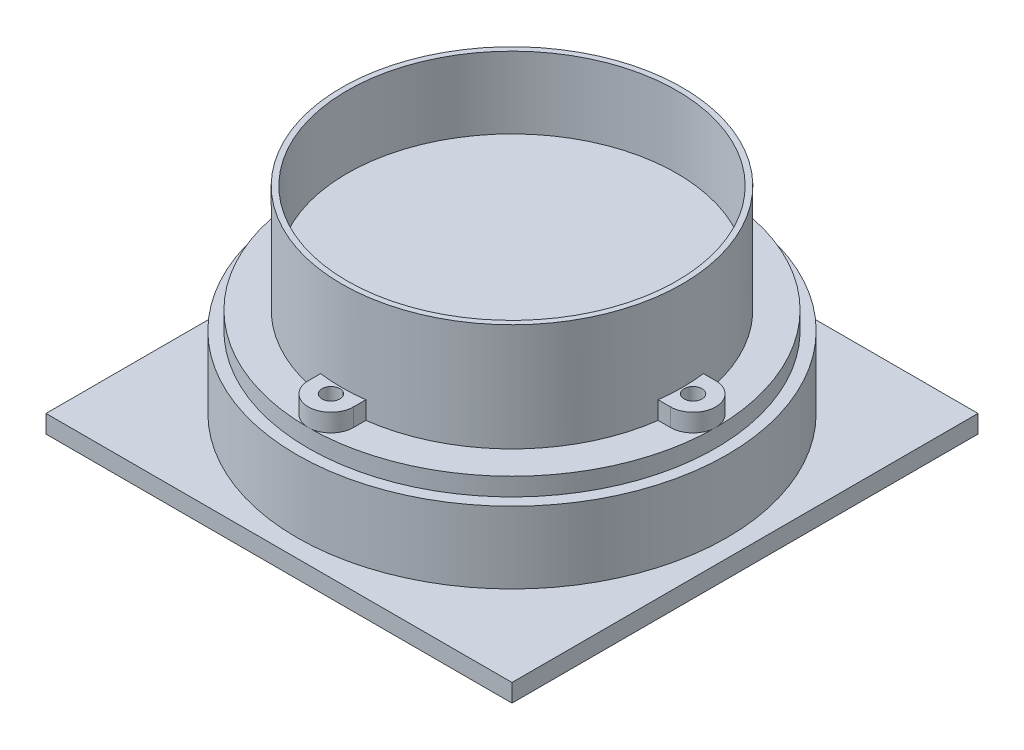
ISO-10303-21;
HEADER;
FILE_DESCRIPTION(('STEP AP214'),'2;1');
FILE_NAME('part.step','',(''),(''),'','','');
FILE_SCHEMA(('AUTOMOTIVE_DESIGN { 1 0 10303 214 1 1 1 1 }'));
ENDSEC;
DATA;
#1=APPLICATION_CONTEXT('core data for automotive mechanical design processes');
#2=APPLICATION_PROTOCOL_DEFINITION('international standard','automotive_design',2000,#1);
#3=PRODUCT_CONTEXT('',#1,'mechanical');
#4=PRODUCT('Part','Part','',(#3));
#5=PRODUCT_RELATED_PRODUCT_CATEGORY('part','',(#4));
#6=PRODUCT_DEFINITION_FORMATION('','',#4);
#7=PRODUCT_DEFINITION_CONTEXT('part definition',#1,'design');
#8=PRODUCT_DEFINITION('design','',#6,#7);
#9=PRODUCT_DEFINITION_SHAPE('','',#8);
#10=(LENGTH_UNIT() NAMED_UNIT(*) SI_UNIT(.MILLI.,.METRE.));
#11=(NAMED_UNIT(*) PLANE_ANGLE_UNIT() SI_UNIT($,.RADIAN.));
#12=(NAMED_UNIT(*) SI_UNIT($,.STERADIAN.) SOLID_ANGLE_UNIT());
#13=UNCERTAINTY_MEASURE_WITH_UNIT(LENGTH_MEASURE(1.E-05),#10,'distance_accuracy_value','');
#14=(GEOMETRIC_REPRESENTATION_CONTEXT(3) GLOBAL_UNCERTAINTY_ASSIGNED_CONTEXT((#13)) GLOBAL_UNIT_ASSIGNED_CONTEXT((#10,
#11,#12)) REPRESENTATION_CONTEXT('',''));
#15=CARTESIAN_POINT('',(0.,0.,0.));
#16=DIRECTION('',(0.,0.,1.));
#17=DIRECTION('',(1.,0.,0.));
#18=AXIS2_PLACEMENT_3D('',#15,#16,#17);
#19=CARTESIAN_POINT('',(0.,63.5,0.));
#20=DIRECTION('',(0.,-1.,0.));
#21=DIRECTION('',(0.,0.,-1.));
#22=AXIS2_PLACEMENT_3D('',#19,#20,#21);
#23=CYLINDRICAL_SURFACE('',#22,120.65);
#24=CARTESIAN_POINT('',(0.,63.5,0.));
#25=DIRECTION('',(0.,1.,0.));
#26=DIRECTION('',(0.,0.,1.));
#27=AXIS2_PLACEMENT_3D('',#24,#25,#26);
#28=CIRCLE('',#27,120.65);
#29=CARTESIAN_POINT('',(0.,63.5,120.65));
#30=VERTEX_POINT('',#29);
#31=EDGE_CURVE('E11',#30,#30,#28,.T.);
#32=ORIENTED_EDGE('',*,*,#31,.F.);
#33=EDGE_LOOP('',(#32));
#34=FACE_BOUND('',#33,.T.);
#35=CARTESIAN_POINT('',(0.,0.,0.));
#36=DIRECTION('',(0.,1.,0.));
#37=DIRECTION('',(0.,0.,1.));
#38=AXIS2_PLACEMENT_3D('',#35,#36,#37);
#39=CIRCLE('',#38,120.65);
#40=CARTESIAN_POINT('',(-16.0262997807594,0.,119.580852210282));
#41=VERTEX_POINT('',#40);
#42=CARTESIAN_POINT('',(16.0262997807595,0.,119.580852210282));
#43=VERTEX_POINT('',#42);
#44=EDGE_CURVE('E315',#41,#43,#39,.T.);
#45=ORIENTED_EDGE('',*,*,#44,.T.);
#46=DIRECTION('',(0.,1.,0.));
#47=VECTOR('',#46,1.);
#48=CARTESIAN_POINT('',(16.0262997807595,-12.7,119.580852210282));
#49=LINE('',#48,#47);
#50=CARTESIAN_POINT('',(16.0262997807595,-12.7,119.580852210282));
#51=VERTEX_POINT('',#50);
#52=EDGE_CURVE('E295',#51,#43,#49,.T.);
#53=ORIENTED_EDGE('',*,*,#52,.F.);
#54=CARTESIAN_POINT('',(0.,-12.7,0.));
#55=DIRECTION('',(0.,-1.,0.));
#56=DIRECTION('',(0.,0.,-1.));
#57=AXIS2_PLACEMENT_3D('',#54,#55,#56);
#58=CIRCLE('',#57,120.65);
#59=CARTESIAN_POINT('',(119.580852210282,-12.7,16.026299780759));
#60=VERTEX_POINT('',#59);
#61=EDGE_CURVE('E257',#60,#51,#58,.T.);
#62=ORIENTED_EDGE('',*,*,#61,.F.);
#63=DIRECTION('',(0.,1.,0.));
#64=VECTOR('',#63,1.);
#65=CARTESIAN_POINT('',(119.580852210282,-12.7,16.026299780759));
#66=LINE('',#65,#64);
#67=CARTESIAN_POINT('',(119.580852210282,0.,16.026299780759));
#68=VERTEX_POINT('',#67);
#69=EDGE_CURVE('E299',#60,#68,#66,.T.);
#70=ORIENTED_EDGE('',*,*,#69,.T.);
#71=CARTESIAN_POINT('',(119.580852210282,0.,-16.0262997807599));
#72=VERTEX_POINT('',#71);
#73=EDGE_CURVE('E42',#68,#72,#39,.T.);
#74=ORIENTED_EDGE('',*,*,#73,.T.);
#75=DIRECTION('',(0.,1.,0.));
#76=VECTOR('',#75,1.);
#77=CARTESIAN_POINT('',(119.580852210282,-12.7,-16.0262997807599));
#78=LINE('',#77,#76);
#79=CARTESIAN_POINT('',(119.580852210282,-12.7,-16.0262997807599));
#80=VERTEX_POINT('',#79);
#81=EDGE_CURVE('E301',#80,#72,#78,.T.);
#82=ORIENTED_EDGE('',*,*,#81,.F.);
#83=CARTESIAN_POINT('',(16.0262997807585,-12.7,-119.580852210282));
#84=VERTEX_POINT('',#83);
#85=EDGE_CURVE('E240',#84,#80,#58,.T.);
#86=ORIENTED_EDGE('',*,*,#85,.F.);
#87=DIRECTION('',(0.,1.,0.));
#88=VECTOR('',#87,1.);
#89=CARTESIAN_POINT('',(16.0262997807585,-12.7,-119.580852210282));
#90=LINE('',#89,#88);
#91=CARTESIAN_POINT('',(16.0262997807585,0.,-119.580852210282));
#92=VERTEX_POINT('',#91);
#93=EDGE_CURVE('E305',#84,#92,#90,.T.);
#94=ORIENTED_EDGE('',*,*,#93,.T.);
#95=CARTESIAN_POINT('',(-16.0262997807603,0.,-119.580852210282));
#96=VERTEX_POINT('',#95);
#97=EDGE_CURVE('E327',#92,#96,#39,.T.);
#98=ORIENTED_EDGE('',*,*,#97,.T.);
#99=DIRECTION('',(0.,1.,0.));
#100=VECTOR('',#99,1.);
#101=CARTESIAN_POINT('',(-16.0262997807603,-12.7,-119.580852210282));
#102=LINE('',#101,#100);
#103=CARTESIAN_POINT('',(-16.0262997807603,-12.7,-119.580852210282));
#104=VERTEX_POINT('',#103);
#105=EDGE_CURVE('E307',#104,#96,#102,.T.);
#106=ORIENTED_EDGE('',*,*,#105,.F.);
#107=CARTESIAN_POINT('',(-119.580852210282,-12.7,-16.0262997807581));
#108=VERTEX_POINT('',#107);
#109=EDGE_CURVE('E235',#108,#104,#58,.T.);
#110=ORIENTED_EDGE('',*,*,#109,.F.);
#111=DIRECTION('',(0.,1.,0.));
#112=VECTOR('',#111,1.);
#113=CARTESIAN_POINT('',(-119.580852210282,-12.7,-16.0262997807581));
#114=LINE('',#113,#112);
#115=CARTESIAN_POINT('',(-119.580852210282,0.,-16.0262997807581));
#116=VERTEX_POINT('',#115);
#117=EDGE_CURVE('E311',#108,#116,#114,.T.);
#118=ORIENTED_EDGE('',*,*,#117,.T.);
#119=CARTESIAN_POINT('',(-119.580852210282,0.,16.0262997807607));
#120=VERTEX_POINT('',#119);
#121=EDGE_CURVE('E329',#116,#120,#39,.T.);
#122=ORIENTED_EDGE('',*,*,#121,.T.);
#123=DIRECTION('',(0.,1.,0.));
#124=VECTOR('',#123,1.);
#125=CARTESIAN_POINT('',(-119.580852210282,-12.7,16.0262997807607));
#126=LINE('',#125,#124);
#127=CARTESIAN_POINT('',(-119.580852210282,-12.7,16.0262997807607));
#128=VERTEX_POINT('',#127);
#129=EDGE_CURVE('E289',#128,#120,#126,.T.);
#130=ORIENTED_EDGE('',*,*,#129,.F.);
#131=CARTESIAN_POINT('',(-16.0262997807594,-12.7,119.580852210282));
#132=VERTEX_POINT('',#131);
#133=EDGE_CURVE('E239',#132,#128,#58,.T.);
#134=ORIENTED_EDGE('',*,*,#133,.F.);
#135=DIRECTION('',(0.,1.,0.));
#136=VECTOR('',#135,1.);
#137=CARTESIAN_POINT('',(-16.0262997807594,-12.7,119.580852210282));
#138=LINE('',#137,#136);
#139=EDGE_CURVE('E293',#132,#41,#138,.T.);
#140=ORIENTED_EDGE('',*,*,#139,.T.);
#141=EDGE_LOOP('',(#45,#53,#62,#70,#74,#82,#86,#94,#98,#106,#110,#118,#122,#130,#134,#140));
#142=FACE_BOUND('',#141,.T.);
#143=ADVANCED_FACE('F34',(#34,#142),#23,.T.);
#144=CARTESIAN_POINT('',(0.,63.5,0.));
#145=DIRECTION('',(0.,1.,0.));
#146=DIRECTION('',(0.,0.,1.));
#147=AXIS2_PLACEMENT_3D('',#144,#145,#146);
#148=PLANE('',#147);
#149=CARTESIAN_POINT('',(0.,63.5,0.));
#150=DIRECTION('',(0.,1.,0.));
#151=DIRECTION('',(0.,0.,1.));
#152=AXIS2_PLACEMENT_3D('',#149,#150,#151);
#153=CIRCLE('',#152,116.84);
#154=CARTESIAN_POINT('',(0.,63.5,116.84));
#155=VERTEX_POINT('',#154);
#156=EDGE_CURVE('E310',#155,#155,#153,.T.);
#157=ORIENTED_EDGE('',*,*,#156,.F.);
#158=EDGE_LOOP('',(#157));
#159=FACE_BOUND('',#158,.T.);
#160=ORIENTED_EDGE('',*,*,#31,.T.);
#161=EDGE_LOOP('',(#160));
#162=FACE_BOUND('',#161,.T.);
#163=ADVANCED_FACE('F478',(#159,#162),#148,.T.);
#164=CARTESIAN_POINT('',(0.,12.7,0.));
#165=DIRECTION('',(0.,1.,0.));
#166=DIRECTION('',(0.,0.,1.));
#167=AXIS2_PLACEMENT_3D('',#164,#165,#166);
#168=CYLINDRICAL_SURFACE('',#167,116.84);
#169=CARTESIAN_POINT('',(0.,12.7,0.));
#170=DIRECTION('',(0.,1.,0.));
#171=DIRECTION('',(0.,0.,1.));
#172=AXIS2_PLACEMENT_3D('',#169,#170,#171);
#173=CIRCLE('',#172,116.84);
#174=CARTESIAN_POINT('',(0.,12.7,116.84));
#175=VERTEX_POINT('',#174);
#176=EDGE_CURVE('E312',#175,#175,#173,.T.);
#177=ORIENTED_EDGE('',*,*,#176,.F.);
#178=EDGE_LOOP('',(#177));
#179=FACE_BOUND('',#178,.T.);
#180=ORIENTED_EDGE('',*,*,#156,.T.);
#181=EDGE_LOOP('',(#180));
#182=FACE_BOUND('',#181,.T.);
#183=ADVANCED_FACE('F483',(#179,#182),#168,.F.);
#184=CARTESIAN_POINT('',(0.,12.7,0.));
#185=DIRECTION('',(0.,1.,0.));
#186=DIRECTION('',(0.,0.,1.));
#187=AXIS2_PLACEMENT_3D('',#184,#185,#186);
#188=PLANE('',#187);
#189=ORIENTED_EDGE('',*,*,#176,.T.);
#190=EDGE_LOOP('',(#189));
#191=FACE_BOUND('',#190,.T.);
#192=ADVANCED_FACE('F490',(#191),#188,.T.);
#193=CARTESIAN_POINT('',(0.,0.,0.));
#194=DIRECTION('',(0.,-1.,0.));
#195=DIRECTION('',(0.,0.,-1.));
#196=AXIS2_PLACEMENT_3D('',#193,#194,#195);
#197=PLANE('',#196);
#198=CARTESIAN_POINT('',(128.324780402935,0.,-4.87942216035457E-13));
#199=DIRECTION('',(0.,1.,0.));
#200=DIRECTION('',(0.,0.,1.));
#201=AXIS2_PLACEMENT_3D('',#198,#199,#200);
#202=CIRCLE('',#201,6.35);
#203=CARTESIAN_POINT('',(128.324780402935,0.,6.34999999999951));
#204=VERTEX_POINT('',#203);
#205=EDGE_CURVE('E747',#204,#204,#202,.T.);
#206=ORIENTED_EDGE('',*,*,#205,.F.);
#207=EDGE_LOOP('',(#206));
#208=FACE_BOUND('',#207,.T.);
#209=ORIENTED_EDGE('',*,*,#73,.F.);
#210=DIRECTION('',(1.,0.,0.));
#211=VECTOR('',#210,1.);
#212=CARTESIAN_POINT('',(0.,0.,16.0262997807594));
#213=LINE('',#212,#211);
#214=CARTESIAN_POINT('',(128.324780402935,0.,16.0262997807589));
#215=VERTEX_POINT('',#214);
#216=EDGE_CURVE('E281',#68,#215,#213,.T.);
#217=ORIENTED_EDGE('',*,*,#216,.T.);
#218=CARTESIAN_POINT('',(128.324780402935,0.,-4.87942216035457E-13));
#219=DIRECTION('',(0.,-1.,0.));
#220=DIRECTION('',(0.,0.,-1.));
#221=AXIS2_PLACEMENT_3D('',#218,#219,#220);
#222=CIRCLE('',#221,16.0262997807594);
#223=CARTESIAN_POINT('',(128.324780402935,0.,-16.0262997807599));
#224=VERTEX_POINT('',#223);
#225=EDGE_CURVE('E278',#215,#224,#222,.F.);
#226=ORIENTED_EDGE('',*,*,#225,.T.);
#227=DIRECTION('',(1.,0.,0.));
#228=VECTOR('',#227,1.);
#229=CARTESIAN_POINT('',(0.,0.,-16.0262997807595));
#230=LINE('',#229,#228);
#231=EDGE_CURVE('E282',#72,#224,#230,.T.);
#232=ORIENTED_EDGE('',*,*,#231,.F.);
#233=EDGE_LOOP('',(#209,#217,#226,#232));
#234=FACE_BOUND('',#233,.T.);
#235=ADVANCED_FACE('F404',(#208,#234),#197,.F.);
#236=CARTESIAN_POINT('',(-9.42924686027354E-13,0.,-128.324780402935));
#237=DIRECTION('',(0.,1.,0.));
#238=DIRECTION('',(0.,0.,1.));
#239=AXIS2_PLACEMENT_3D('',#236,#237,#238);
#240=CIRCLE('',#239,6.35);
#241=CARTESIAN_POINT('',(-9.42924686027354E-13,0.,-121.974780402935));
#242=VERTEX_POINT('',#241);
#243=EDGE_CURVE('E761',#242,#242,#240,.T.);
#244=ORIENTED_EDGE('',*,*,#243,.F.);
#245=EDGE_LOOP('',(#244));
#246=FACE_BOUND('',#245,.T.);
#247=ORIENTED_EDGE('',*,*,#97,.F.);
#248=DIRECTION('',(0.,0.,-1.));
#249=VECTOR('',#248,1.);
#250=CARTESIAN_POINT('',(16.0262997807593,0.,-1.0810252862402E-13));
#251=LINE('',#250,#249);
#252=CARTESIAN_POINT('',(16.0262997807585,0.,-128.324780402935));
#253=VERTEX_POINT('',#252);
#254=EDGE_CURVE('E276',#92,#253,#251,.T.);
#255=ORIENTED_EDGE('',*,*,#254,.T.);
#256=CARTESIAN_POINT('',(-9.42924686027354E-13,0.,-128.324780402935));
#257=DIRECTION('',(0.,-1.,0.));
#258=DIRECTION('',(0.,0.,-1.));
#259=AXIS2_PLACEMENT_3D('',#256,#257,#258);
#260=CIRCLE('',#259,16.0262997807594);
#261=CARTESIAN_POINT('',(-16.0262997807604,0.,-128.324780402935));
#262=VERTEX_POINT('',#261);
#263=EDGE_CURVE('E273',#253,#262,#260,.F.);
#264=ORIENTED_EDGE('',*,*,#263,.T.);
#265=DIRECTION('',(0.,0.,-1.));
#266=VECTOR('',#265,1.);
#267=CARTESIAN_POINT('',(-16.0262997807595,0.,1.0810252862402E-13));
#268=LINE('',#267,#266);
#269=EDGE_CURVE('E277',#96,#262,#268,.T.);
#270=ORIENTED_EDGE('',*,*,#269,.F.);
#271=EDGE_LOOP('',(#247,#255,#264,#270));
#272=FACE_BOUND('',#271,.T.);
#273=ADVANCED_FACE('F439',(#246,#272),#197,.F.);
#274=CARTESIAN_POINT('',(-128.324780402935,0.,1.41178494382707E-12));
#275=DIRECTION('',(0.,1.,0.));
#276=DIRECTION('',(0.,0.,1.));
#277=AXIS2_PLACEMENT_3D('',#274,#275,#276);
#278=CIRCLE('',#277,6.35);
#279=CARTESIAN_POINT('',(-128.324780402935,0.,6.35000000000141));
#280=VERTEX_POINT('',#279);
#281=EDGE_CURVE('E755',#280,#280,#278,.T.);
#282=ORIENTED_EDGE('',*,*,#281,.F.);
#283=EDGE_LOOP('',(#282));
#284=FACE_BOUND('',#283,.T.);
#285=ORIENTED_EDGE('',*,*,#121,.F.);
#286=DIRECTION('',(-1.,0.,0.));
#287=VECTOR('',#286,1.);
#288=CARTESIAN_POINT('',(-1.6533327907203E-13,0.,-16.0262997807593));
#289=LINE('',#288,#287);
#290=CARTESIAN_POINT('',(-128.324780402935,0.,-16.026299780758));
#291=VERTEX_POINT('',#290);
#292=EDGE_CURVE('E272',#116,#291,#289,.T.);
#293=ORIENTED_EDGE('',*,*,#292,.T.);
#294=CARTESIAN_POINT('',(-128.324780402935,0.,1.41178494382707E-12));
#295=DIRECTION('',(0.,-1.,0.));
#296=DIRECTION('',(0.,0.,-1.));
#297=AXIS2_PLACEMENT_3D('',#294,#295,#296);
#298=CIRCLE('',#297,16.0262997807594);
#299=CARTESIAN_POINT('',(-128.324780402935,0.,16.0262997807608));
#300=VERTEX_POINT('',#299);
#301=EDGE_CURVE('E224',#291,#300,#298,.F.);
#302=ORIENTED_EDGE('',*,*,#301,.T.);
#303=DIRECTION('',(-1.,0.,0.));
#304=VECTOR('',#303,1.);
#305=CARTESIAN_POINT('',(1.65333279072031E-13,0.,16.0262997807595));
#306=LINE('',#305,#304);
#307=EDGE_CURVE('E361',#120,#300,#306,.T.);
#308=ORIENTED_EDGE('',*,*,#307,.F.);
#309=EDGE_LOOP('',(#285,#293,#302,#308));
#310=FACE_BOUND('',#309,.T.);
#311=ADVANCED_FACE('F455',(#284,#310),#197,.F.);
#312=CARTESIAN_POINT('',(-128.324780402935,-12.7,1.41178494382707E-12));
#313=DIRECTION('',(0.,1.,0.));
#314=DIRECTION('',(0.,0.,1.));
#315=AXIS2_PLACEMENT_3D('',#312,#313,#314);
#316=CYLINDRICAL_SURFACE('',#315,16.0262997807594);
#317=ORIENTED_EDGE('',*,*,#301,.F.);
#318=DIRECTION('',(0.,1.,0.));
#319=VECTOR('',#318,1.);
#320=CARTESIAN_POINT('',(-128.324780402935,-12.7,-16.026299780758));
#321=LINE('',#320,#319);
#322=CARTESIAN_POINT('',(-128.324780402935,-12.7,-16.026299780758));
#323=VERTEX_POINT('',#322);
#324=EDGE_CURVE('E308',#323,#291,#321,.T.);
#325=ORIENTED_EDGE('',*,*,#324,.F.);
#326=CARTESIAN_POINT('',(-128.324780402935,-12.7,1.41178494382707E-12));
#327=DIRECTION('',(0.,-1.,0.));
#328=DIRECTION('',(0.,0.,-1.));
#329=AXIS2_PLACEMENT_3D('',#326,#327,#328);
#330=CIRCLE('',#329,16.0262997807594);
#331=CARTESIAN_POINT('',(-144.351080183694,-12.7,1.58810076267898E-12));
#332=VERTEX_POINT('',#331);
#333=EDGE_CURVE('E229',#323,#332,#330,.F.);
#334=ORIENTED_EDGE('',*,*,#333,.T.);
#335=CARTESIAN_POINT('',(-128.324780402935,-12.7,16.0262997807608));
#336=VERTEX_POINT('',#335);
#337=EDGE_CURVE('E232',#332,#336,#330,.F.);
#338=ORIENTED_EDGE('',*,*,#337,.T.);
#339=DIRECTION('',(0.,1.,0.));
#340=VECTOR('',#339,1.);
#341=CARTESIAN_POINT('',(-128.324780402935,-12.7,16.0262997807608));
#342=LINE('',#341,#340);
#343=EDGE_CURVE('E269',#336,#300,#342,.T.);
#344=ORIENTED_EDGE('',*,*,#343,.T.);
#345=EDGE_LOOP('',(#317,#325,#334,#338,#344));
#346=FACE_BOUND('',#345,.T.);
#347=ADVANCED_FACE('F498',(#346),#316,.T.);
#348=CARTESIAN_POINT('',(-1.6533327907203E-13,-12.7,-16.0262997807593));
#349=DIRECTION('',(0.,0.,-1.));
#350=DIRECTION('',(-1.,0.,0.));
#351=AXIS2_PLACEMENT_3D('',#348,#349,#350);
#352=PLANE('',#351);
#353=ORIENTED_EDGE('',*,*,#292,.F.);
#354=ORIENTED_EDGE('',*,*,#117,.F.);
#355=DIRECTION('',(-1.,0.,0.));
#356=VECTOR('',#355,1.);
#357=CARTESIAN_POINT('',(-1.6533327907203E-13,-12.7,-16.0262997807593));
#358=LINE('',#357,#356);
#359=EDGE_CURVE('E231',#108,#323,#358,.T.);
#360=ORIENTED_EDGE('',*,*,#359,.T.);
#361=ORIENTED_EDGE('',*,*,#324,.T.);
#362=EDGE_LOOP('',(#353,#354,#360,#361));
#363=FACE_BOUND('',#362,.T.);
#364=ADVANCED_FACE('F452',(#363),#352,.T.);
#365=CARTESIAN_POINT('',(-16.0262997807595,-12.7,1.0810252862402E-13));
#366=DIRECTION('',(1.,0.,0.));
#367=DIRECTION('',(0.,0.,-1.));
#368=AXIS2_PLACEMENT_3D('',#365,#366,#367);
#369=PLANE('',#368);
#370=ORIENTED_EDGE('',*,*,#269,.T.);
#371=DIRECTION('',(0.,1.,0.));
#372=VECTOR('',#371,1.);
#373=CARTESIAN_POINT('',(-16.0262997807604,-12.7,-128.324780402935));
#374=LINE('',#373,#372);
#375=CARTESIAN_POINT('',(-16.0262997807604,-12.7,-128.324780402935));
#376=VERTEX_POINT('',#375);
#377=EDGE_CURVE('E304',#376,#262,#374,.T.);
#378=ORIENTED_EDGE('',*,*,#377,.F.);
#379=DIRECTION('',(0.,0.,-1.));
#380=VECTOR('',#379,1.);
#381=CARTESIAN_POINT('',(-16.0262997807595,-12.7,1.0810252862402E-13));
#382=LINE('',#381,#380);
#383=EDGE_CURVE('E238',#104,#376,#382,.T.);
#384=ORIENTED_EDGE('',*,*,#383,.F.);
#385=ORIENTED_EDGE('',*,*,#105,.T.);
#386=EDGE_LOOP('',(#370,#378,#384,#385));
#387=FACE_BOUND('',#386,.T.);
#388=ADVANCED_FACE('F443',(#387),#369,.F.);
#389=CARTESIAN_POINT('',(-9.42924686027354E-13,-12.7,-128.324780402935));
#390=DIRECTION('',(0.,1.,0.));
#391=DIRECTION('',(0.,0.,1.));
#392=AXIS2_PLACEMENT_3D('',#389,#390,#391);
#393=CYLINDRICAL_SURFACE('',#392,16.0262997807594);
#394=ORIENTED_EDGE('',*,*,#263,.F.);
#395=DIRECTION('',(0.,1.,0.));
#396=VECTOR('',#395,1.);
#397=CARTESIAN_POINT('',(16.0262997807585,-12.7,-128.324780402935));
#398=LINE('',#397,#396);
#399=CARTESIAN_POINT('',(16.0262997807585,-12.7,-128.324780402935));
#400=VERTEX_POINT('',#399);
#401=EDGE_CURVE('E302',#400,#253,#398,.T.);
#402=ORIENTED_EDGE('',*,*,#401,.F.);
#403=CARTESIAN_POINT('',(-9.42924686027354E-13,-12.7,-128.324780402935));
#404=DIRECTION('',(0.,-1.,0.));
#405=DIRECTION('',(0.,0.,-1.));
#406=AXIS2_PLACEMENT_3D('',#403,#404,#405);
#407=CIRCLE('',#406,16.0262997807594);
#408=CARTESIAN_POINT('',(-1.06068521241597E-12,-12.7,-144.351080183694));
#409=VERTEX_POINT('',#408);
#410=EDGE_CURVE('E244',#400,#409,#407,.F.);
#411=ORIENTED_EDGE('',*,*,#410,.T.);
#412=EDGE_CURVE('E243',#409,#376,#407,.F.);
#413=ORIENTED_EDGE('',*,*,#412,.T.);
#414=ORIENTED_EDGE('',*,*,#377,.T.);
#415=EDGE_LOOP('',(#394,#402,#411,#413,#414));
#416=FACE_BOUND('',#415,.T.);
#417=ADVANCED_FACE('F506',(#416),#393,.T.);
#418=CARTESIAN_POINT('',(16.0262997807593,-12.7,-1.0810252862402E-13));
#419=DIRECTION('',(1.,0.,0.));
#420=DIRECTION('',(0.,0.,-1.));
#421=AXIS2_PLACEMENT_3D('',#418,#419,#420);
#422=PLANE('',#421);
#423=ORIENTED_EDGE('',*,*,#254,.F.);
#424=ORIENTED_EDGE('',*,*,#93,.F.);
#425=DIRECTION('',(0.,0.,-1.));
#426=VECTOR('',#425,1.);
#427=CARTESIAN_POINT('',(16.0262997807593,-12.7,-1.0810252862402E-13));
#428=LINE('',#427,#426);
#429=EDGE_CURVE('E246',#84,#400,#428,.T.);
#430=ORIENTED_EDGE('',*,*,#429,.T.);
#431=ORIENTED_EDGE('',*,*,#401,.T.);
#432=EDGE_LOOP('',(#423,#424,#430,#431));
#433=FACE_BOUND('',#432,.T.);
#434=ADVANCED_FACE('F436',(#433),#422,.T.);
#435=CARTESIAN_POINT('',(0.,-12.7,-16.0262997807595));
#436=DIRECTION('',(0.,0.,1.));
#437=DIRECTION('',(1.,0.,0.));
#438=AXIS2_PLACEMENT_3D('',#435,#436,#437);
#439=PLANE('',#438);
#440=ORIENTED_EDGE('',*,*,#231,.T.);
#441=DIRECTION('',(0.,1.,0.));
#442=VECTOR('',#441,1.);
#443=CARTESIAN_POINT('',(128.324780402935,-12.7,-16.0262997807599));
#444=LINE('',#443,#442);
#445=CARTESIAN_POINT('',(128.324780402935,-12.7,-16.0262997807599));
#446=VERTEX_POINT('',#445);
#447=EDGE_CURVE('E298',#446,#224,#444,.T.);
#448=ORIENTED_EDGE('',*,*,#447,.F.);
#449=DIRECTION('',(1.,0.,0.));
#450=VECTOR('',#449,1.);
#451=CARTESIAN_POINT('',(0.,-12.7,-16.0262997807595));
#452=LINE('',#451,#450);
#453=EDGE_CURVE('E249',#80,#446,#452,.T.);
#454=ORIENTED_EDGE('',*,*,#453,.F.);
#455=ORIENTED_EDGE('',*,*,#81,.T.);
#456=EDGE_LOOP('',(#440,#448,#454,#455));
#457=FACE_BOUND('',#456,.T.);
#458=ADVANCED_FACE('F415',(#457),#439,.F.);
#459=CARTESIAN_POINT('',(128.324780402935,-12.7,-4.87942216035457E-13));
#460=DIRECTION('',(0.,1.,0.));
#461=DIRECTION('',(0.,0.,1.));
#462=AXIS2_PLACEMENT_3D('',#459,#460,#461);
#463=CYLINDRICAL_SURFACE('',#462,16.0262997807594);
#464=ORIENTED_EDGE('',*,*,#225,.F.);
#465=DIRECTION('',(0.,1.,0.));
#466=VECTOR('',#465,1.);
#467=CARTESIAN_POINT('',(128.324780402935,-12.7,16.0262997807589));
#468=LINE('',#467,#466);
#469=CARTESIAN_POINT('',(128.324780402935,-12.7,16.0262997807589));
#470=VERTEX_POINT('',#469);
#471=EDGE_CURVE('E296',#470,#215,#468,.T.);
#472=ORIENTED_EDGE('',*,*,#471,.F.);
#473=CARTESIAN_POINT('',(128.324780402935,-12.7,-4.87942216035457E-13));
#474=DIRECTION('',(0.,-1.,0.));
#475=DIRECTION('',(0.,0.,-1.));
#476=AXIS2_PLACEMENT_3D('',#473,#474,#475);
#477=CIRCLE('',#476,16.0262997807594);
#478=CARTESIAN_POINT('',(144.351080183694,-12.7,-5.48880627192819E-13));
#479=VERTEX_POINT('',#478);
#480=EDGE_CURVE('E58',#470,#479,#477,.F.);
#481=ORIENTED_EDGE('',*,*,#480,.T.);
#482=EDGE_CURVE('E252',#479,#446,#477,.F.);
#483=ORIENTED_EDGE('',*,*,#482,.T.);
#484=ORIENTED_EDGE('',*,*,#447,.T.);
#485=EDGE_LOOP('',(#464,#472,#481,#483,#484));
#486=FACE_BOUND('',#485,.T.);
#487=ADVANCED_FACE('F411',(#486),#463,.T.);
#488=CARTESIAN_POINT('',(0.,-12.7,16.0262997807594));
#489=DIRECTION('',(0.,0.,1.));
#490=DIRECTION('',(1.,0.,0.));
#491=AXIS2_PLACEMENT_3D('',#488,#489,#490);
#492=PLANE('',#491);
#493=ORIENTED_EDGE('',*,*,#216,.F.);
#494=ORIENTED_EDGE('',*,*,#69,.F.);
#495=DIRECTION('',(1.,0.,0.));
#496=VECTOR('',#495,1.);
#497=CARTESIAN_POINT('',(0.,-12.7,16.0262997807594));
#498=LINE('',#497,#496);
#499=EDGE_CURVE('E254',#60,#470,#498,.T.);
#500=ORIENTED_EDGE('',*,*,#499,.T.);
#501=ORIENTED_EDGE('',*,*,#471,.T.);
#502=EDGE_LOOP('',(#493,#494,#500,#501));
#503=FACE_BOUND('',#502,.T.);
#504=ADVANCED_FACE('F409',(#503),#492,.T.);
#505=CARTESIAN_POINT('',(16.0262997807595,-12.7,0.));
#506=DIRECTION('',(-1.,0.,0.));
#507=DIRECTION('',(0.,0.,1.));
#508=AXIS2_PLACEMENT_3D('',#505,#506,#507);
#509=PLANE('',#508);
#510=DIRECTION('',(0.,0.,1.));
#511=VECTOR('',#510,1.);
#512=CARTESIAN_POINT('',(16.0262997807595,0.,0.));
#513=LINE('',#512,#511);
#514=CARTESIAN_POINT('',(16.0262997807595,0.,128.324780402935));
#515=VERTEX_POINT('',#514);
#516=EDGE_CURVE('E287',#43,#515,#513,.T.);
#517=ORIENTED_EDGE('',*,*,#516,.T.);
#518=DIRECTION('',(0.,1.,0.));
#519=VECTOR('',#518,1.);
#520=CARTESIAN_POINT('',(16.0262997807595,-12.7,128.324780402935));
#521=LINE('',#520,#519);
#522=CARTESIAN_POINT('',(16.0262997807595,-12.7,128.324780402935));
#523=VERTEX_POINT('',#522);
#524=EDGE_CURVE('E292',#523,#515,#521,.T.);
#525=ORIENTED_EDGE('',*,*,#524,.F.);
#526=DIRECTION('',(0.,0.,1.));
#527=VECTOR('',#526,1.);
#528=CARTESIAN_POINT('',(16.0262997807595,-12.7,0.));
#529=LINE('',#528,#527);
#530=EDGE_CURVE('E258',#51,#523,#529,.T.);
#531=ORIENTED_EDGE('',*,*,#530,.F.);
#532=ORIENTED_EDGE('',*,*,#52,.T.);
#533=EDGE_LOOP('',(#517,#525,#531,#532));
#534=FACE_BOUND('',#533,.T.);
#535=ADVANCED_FACE('F347',(#534),#509,.F.);
#536=CARTESIAN_POINT('',(0.,-12.7,128.324780402935));
#537=DIRECTION('',(0.,1.,0.));
#538=DIRECTION('',(0.,0.,1.));
#539=AXIS2_PLACEMENT_3D('',#536,#537,#538);
#540=CYLINDRICAL_SURFACE('',#539,16.0262997807594);
#541=CARTESIAN_POINT('',(0.,0.,128.324780402935));
#542=DIRECTION('',(0.,-1.,0.));
#543=DIRECTION('',(0.,0.,-1.));
#544=AXIS2_PLACEMENT_3D('',#541,#542,#543);
#545=CIRCLE('',#544,16.0262997807594);
#546=CARTESIAN_POINT('',(-16.0262997807594,0.,128.324780402935));
#547=VERTEX_POINT('',#546);
#548=EDGE_CURVE('E283',#547,#515,#545,.F.);
#549=ORIENTED_EDGE('',*,*,#548,.F.);
#550=DIRECTION('',(0.,1.,0.));
#551=VECTOR('',#550,1.);
#552=CARTESIAN_POINT('',(-16.0262997807594,-12.7,128.324780402935));
#553=LINE('',#552,#551);
#554=CARTESIAN_POINT('',(-16.0262997807594,-12.7,128.324780402935));
#555=VERTEX_POINT('',#554);
#556=EDGE_CURVE('E290',#555,#547,#553,.T.);
#557=ORIENTED_EDGE('',*,*,#556,.F.);
#558=CARTESIAN_POINT('',(0.,-12.7,128.324780402935));
#559=DIRECTION('',(0.,-1.,0.));
#560=DIRECTION('',(0.,0.,-1.));
#561=AXIS2_PLACEMENT_3D('',#558,#559,#560);
#562=CIRCLE('',#561,16.0262997807594);
#563=CARTESIAN_POINT('',(0.,-12.7,144.351080183694));
#564=VERTEX_POINT('',#563);
#565=EDGE_CURVE('E50',#555,#564,#562,.F.);
#566=ORIENTED_EDGE('',*,*,#565,.T.);
#567=EDGE_CURVE('E261',#564,#523,#562,.F.);
#568=ORIENTED_EDGE('',*,*,#567,.T.);
#569=ORIENTED_EDGE('',*,*,#524,.T.);
#570=EDGE_LOOP('',(#549,#557,#566,#568,#569));
#571=FACE_BOUND('',#570,.T.);
#572=ADVANCED_FACE('F468',(#571),#540,.T.);
#573=CARTESIAN_POINT('',(-16.0262997807594,-12.7,0.));
#574=DIRECTION('',(-1.,0.,0.));
#575=DIRECTION('',(0.,0.,1.));
#576=AXIS2_PLACEMENT_3D('',#573,#574,#575);
#577=PLANE('',#576);
#578=DIRECTION('',(0.,0.,1.));
#579=VECTOR('',#578,1.);
#580=CARTESIAN_POINT('',(-16.0262997807594,0.,0.));
#581=LINE('',#580,#579);
#582=EDGE_CURVE('E286',#41,#547,#581,.T.);
#583=ORIENTED_EDGE('',*,*,#582,.F.);
#584=ORIENTED_EDGE('',*,*,#139,.F.);
#585=DIRECTION('',(0.,0.,1.));
#586=VECTOR('',#585,1.);
#587=CARTESIAN_POINT('',(-16.0262997807594,-12.7,0.));
#588=LINE('',#587,#586);
#589=EDGE_CURVE('E263',#132,#555,#588,.T.);
#590=ORIENTED_EDGE('',*,*,#589,.T.);
#591=ORIENTED_EDGE('',*,*,#556,.T.);
#592=EDGE_LOOP('',(#583,#584,#590,#591));
#593=FACE_BOUND('',#592,.T.);
#594=ADVANCED_FACE('F467',(#593),#577,.T.);
#595=CARTESIAN_POINT('',(1.65333279072031E-13,-12.7,16.0262997807595));
#596=DIRECTION('',(0.,0.,-1.));
#597=DIRECTION('',(-1.,0.,0.));
#598=AXIS2_PLACEMENT_3D('',#595,#596,#597);
#599=PLANE('',#598);
#600=ORIENTED_EDGE('',*,*,#307,.T.);
#601=ORIENTED_EDGE('',*,*,#343,.F.);
#602=DIRECTION('',(-1.,0.,0.));
#603=VECTOR('',#602,1.);
#604=CARTESIAN_POINT('',(1.65333279072031E-13,-12.7,16.0262997807595));
#605=LINE('',#604,#603);
#606=EDGE_CURVE('E266',#128,#336,#605,.T.);
#607=ORIENTED_EDGE('',*,*,#606,.F.);
#608=ORIENTED_EDGE('',*,*,#129,.T.);
#609=EDGE_LOOP('',(#600,#601,#607,#608));
#610=FACE_BOUND('',#609,.T.);
#611=ADVANCED_FACE('F458',(#610),#599,.F.);
#612=CARTESIAN_POINT('',(0.,0.,128.324780402935));
#613=DIRECTION('',(0.,1.,0.));
#614=DIRECTION('',(0.,0.,1.));
#615=AXIS2_PLACEMENT_3D('',#612,#613,#614);
#616=CIRCLE('',#615,6.35);
#617=CARTESIAN_POINT('',(0.,0.,134.674780402935));
#618=VERTEX_POINT('',#617);
#619=EDGE_CURVE('E749',#618,#618,#616,.T.);
#620=ORIENTED_EDGE('',*,*,#619,.F.);
#621=EDGE_LOOP('',(#620));
#622=FACE_BOUND('',#621,.T.);
#623=ORIENTED_EDGE('',*,*,#44,.F.);
#624=ORIENTED_EDGE('',*,*,#582,.T.);
#625=ORIENTED_EDGE('',*,*,#548,.T.);
#626=ORIENTED_EDGE('',*,*,#516,.F.);
#627=EDGE_LOOP('',(#623,#624,#625,#626));
#628=FACE_BOUND('',#627,.T.);
#629=ADVANCED_FACE('F342',(#622,#628),#197,.F.);
#630=CARTESIAN_POINT('',(0.,-12.7,0.));
#631=DIRECTION('',(0.,-1.,0.));
#632=DIRECTION('',(0.,0.,-1.));
#633=AXIS2_PLACEMENT_3D('',#630,#631,#632);
#634=PLANE('',#633);
#635=ORIENTED_EDGE('',*,*,#410,.F.);
#636=ORIENTED_EDGE('',*,*,#429,.F.);
#637=ORIENTED_EDGE('',*,*,#85,.T.);
#638=ORIENTED_EDGE('',*,*,#453,.T.);
#639=ORIENTED_EDGE('',*,*,#482,.F.);
#640=CARTESIAN_POINT('',(0.,-12.7,0.));
#641=DIRECTION('',(0.,-1.,0.));
#642=DIRECTION('',(0.,0.,-1.));
#643=AXIS2_PLACEMENT_3D('',#640,#641,#642);
#644=CIRCLE('',#643,144.351080183694);
#645=EDGE_CURVE('E225',#409,#479,#644,.T.);
#646=ORIENTED_EDGE('',*,*,#645,.F.);
#647=EDGE_LOOP('',(#635,#636,#637,#638,#639,#646));
#648=FACE_BOUND('',#647,.T.);
#649=ADVANCED_FACE('F431',(#648),#634,.F.);
#650=ORIENTED_EDGE('',*,*,#480,.F.);
#651=ORIENTED_EDGE('',*,*,#499,.F.);
#652=ORIENTED_EDGE('',*,*,#61,.T.);
#653=ORIENTED_EDGE('',*,*,#530,.T.);
#654=ORIENTED_EDGE('',*,*,#567,.F.);
#655=EDGE_CURVE('E228',#479,#564,#644,.T.);
#656=ORIENTED_EDGE('',*,*,#655,.F.);
#657=EDGE_LOOP('',(#650,#651,#652,#653,#654,#656));
#658=FACE_BOUND('',#657,.T.);
#659=ADVANCED_FACE('F418',(#658),#634,.F.);
#660=ORIENTED_EDGE('',*,*,#337,.F.);
#661=EDGE_CURVE('E424',#564,#332,#644,.T.);
#662=ORIENTED_EDGE('',*,*,#661,.F.);
#663=ORIENTED_EDGE('',*,*,#565,.F.);
#664=ORIENTED_EDGE('',*,*,#589,.F.);
#665=ORIENTED_EDGE('',*,*,#133,.T.);
#666=ORIENTED_EDGE('',*,*,#606,.T.);
#667=EDGE_LOOP('',(#660,#662,#663,#664,#665,#666));
#668=FACE_BOUND('',#667,.T.);
#669=ADVANCED_FACE('F465',(#668),#634,.F.);
#670=CARTESIAN_POINT('',(0.,-25.4,0.));
#671=DIRECTION('',(0.,1.,0.));
#672=DIRECTION('',(0.,0.,1.));
#673=AXIS2_PLACEMENT_3D('',#670,#671,#672);
#674=CYLINDRICAL_SURFACE('',#673,144.351080183694);
#675=CARTESIAN_POINT('',(0.,-25.4,0.));
#676=DIRECTION('',(0.,-1.,0.));
#677=DIRECTION('',(0.,0.,-1.));
#678=AXIS2_PLACEMENT_3D('',#675,#676,#677);
#679=CIRCLE('',#678,144.351080183694);
#680=CARTESIAN_POINT('',(0.,-25.4,-144.351080183694));
#681=VERTEX_POINT('',#680);
#682=EDGE_CURVE('E221',#681,#681,#679,.T.);
#683=ORIENTED_EDGE('',*,*,#682,.F.);
#684=EDGE_LOOP('',(#683));
#685=FACE_BOUND('',#684,.T.);
#686=ORIENTED_EDGE('',*,*,#645,.T.);
#687=ORIENTED_EDGE('',*,*,#655,.T.);
#688=ORIENTED_EDGE('',*,*,#661,.T.);
#689=EDGE_CURVE('E219',#332,#409,#644,.T.);
#690=ORIENTED_EDGE('',*,*,#689,.T.);
#691=EDGE_LOOP('',(#686,#687,#688,#690));
#692=FACE_BOUND('',#691,.T.);
#693=ADVANCED_FACE('F427',(#685,#692),#674,.T.);
#694=ORIENTED_EDGE('',*,*,#109,.T.);
#695=ORIENTED_EDGE('',*,*,#383,.T.);
#696=ORIENTED_EDGE('',*,*,#412,.F.);
#697=ORIENTED_EDGE('',*,*,#689,.F.);
#698=ORIENTED_EDGE('',*,*,#333,.F.);
#699=ORIENTED_EDGE('',*,*,#359,.F.);
#700=EDGE_LOOP('',(#694,#695,#696,#697,#698,#699));
#701=FACE_BOUND('',#700,.T.);
#702=ADVANCED_FACE('F450',(#701),#634,.F.);
#703=CARTESIAN_POINT('',(0.,-76.2,0.));
#704=DIRECTION('',(0.,1.,0.));
#705=DIRECTION('',(0.,0.,1.));
#706=AXIS2_PLACEMENT_3D('',#703,#704,#705);
#707=CYLINDRICAL_SURFACE('',#706,152.4);
#708=CARTESIAN_POINT('',(0.,-76.2,0.));
#709=DIRECTION('',(0.,-1.,0.));
#710=DIRECTION('',(0.,0.,-1.));
#711=AXIS2_PLACEMENT_3D('',#708,#709,#710);
#712=CIRCLE('',#711,152.4);
#713=CARTESIAN_POINT('',(0.,-76.2,-152.4));
#714=VERTEX_POINT('',#713);
#715=EDGE_CURVE('E212',#714,#714,#712,.T.);
#716=ORIENTED_EDGE('',*,*,#715,.F.);
#717=EDGE_LOOP('',(#716));
#718=FACE_BOUND('',#717,.T.);
#719=CARTESIAN_POINT('',(0.,-25.4,0.));
#720=DIRECTION('',(0.,-1.,0.));
#721=DIRECTION('',(0.,0.,-1.));
#722=AXIS2_PLACEMENT_3D('',#719,#720,#721);
#723=CIRCLE('',#722,152.4);
#724=CARTESIAN_POINT('',(0.,-25.4,-152.4));
#725=VERTEX_POINT('',#724);
#726=EDGE_CURVE('E209',#725,#725,#723,.T.);
#727=ORIENTED_EDGE('',*,*,#726,.T.);
#728=EDGE_LOOP('',(#727));
#729=FACE_BOUND('',#728,.T.);
#730=ADVANCED_FACE('F586',(#718,#729),#707,.T.);
#731=CARTESIAN_POINT('',(0.,-25.4,0.));
#732=DIRECTION('',(0.,-1.,0.));
#733=DIRECTION('',(0.,0.,-1.));
#734=AXIS2_PLACEMENT_3D('',#731,#732,#733);
#735=PLANE('',#734);
#736=ORIENTED_EDGE('',*,*,#682,.T.);
#737=EDGE_LOOP('',(#736));
#738=FACE_BOUND('',#737,.T.);
#739=ORIENTED_EDGE('',*,*,#726,.F.);
#740=EDGE_LOOP('',(#739));
#741=FACE_BOUND('',#740,.T.);
#742=ADVANCED_FACE('F594',(#738,#741),#735,.F.);
#743=CARTESIAN_POINT('',(165.1,-88.9,-165.1));
#744=DIRECTION('',(-1.,0.,0.));
#745=DIRECTION('',(0.,0.,1.));
#746=AXIS2_PLACEMENT_3D('',#743,#744,#745);
#747=PLANE('',#746);
#748=DIRECTION('',(0.,0.,1.));
#749=VECTOR('',#748,1.);
#750=CARTESIAN_POINT('',(165.1,-76.2,-165.1));
#751=LINE('',#750,#749);
#752=CARTESIAN_POINT('',(165.1,-76.2,-165.1));
#753=VERTEX_POINT('',#752);
#754=CARTESIAN_POINT('',(165.1,-76.2,165.1));
#755=VERTEX_POINT('',#754);
#756=EDGE_CURVE('E208',#753,#755,#751,.T.);
#757=ORIENTED_EDGE('',*,*,#756,.T.);
#758=DIRECTION('',(0.,1.,0.));
#759=VECTOR('',#758,1.);
#760=CARTESIAN_POINT('',(165.1,-88.9,165.1));
#761=LINE('',#760,#759);
#762=CARTESIAN_POINT('',(165.1,-88.9,165.1));
#763=VERTEX_POINT('',#762);
#764=EDGE_CURVE('E188',#763,#755,#761,.T.);
#765=ORIENTED_EDGE('',*,*,#764,.F.);
#766=DIRECTION('',(0.,0.,1.));
#767=VECTOR('',#766,1.);
#768=CARTESIAN_POINT('',(165.1,-88.9,-165.1));
#769=LINE('',#768,#767);
#770=CARTESIAN_POINT('',(165.1,-88.9,-165.1));
#771=VERTEX_POINT('',#770);
#772=EDGE_CURVE('E195',#771,#763,#769,.T.);
#773=ORIENTED_EDGE('',*,*,#772,.F.);
#774=DIRECTION('',(0.,1.,0.));
#775=VECTOR('',#774,1.);
#776=CARTESIAN_POINT('',(165.1,-88.9,-165.1));
#777=LINE('',#776,#775);
#778=EDGE_CURVE('E771',#771,#753,#777,.T.);
#779=ORIENTED_EDGE('',*,*,#778,.T.);
#780=EDGE_LOOP('',(#757,#765,#773,#779));
#781=FACE_BOUND('',#780,.T.);
#782=ADVANCED_FACE('F206',(#781),#747,.F.);
#783=CARTESIAN_POINT('',(-165.1,-88.9,165.1));
#784=DIRECTION('',(0.,0.,-1.));
#785=DIRECTION('',(-1.,0.,0.));
#786=AXIS2_PLACEMENT_3D('',#783,#784,#785);
#787=PLANE('',#786);
#788=DIRECTION('',(-1.,0.,0.));
#789=VECTOR('',#788,1.);
#790=CARTESIAN_POINT('',(-165.1,-76.2,165.1));
#791=LINE('',#790,#789);
#792=CARTESIAN_POINT('',(-165.1,-76.2,165.1));
#793=VERTEX_POINT('',#792);
#794=EDGE_CURVE('E773',#755,#793,#791,.T.);
#795=ORIENTED_EDGE('',*,*,#794,.T.);
#796=DIRECTION('',(0.,1.,0.));
#797=VECTOR('',#796,1.);
#798=CARTESIAN_POINT('',(-165.1,-88.9,165.1));
#799=LINE('',#798,#797);
#800=CARTESIAN_POINT('',(-165.1,-88.9,165.1));
#801=VERTEX_POINT('',#800);
#802=EDGE_CURVE('E191',#801,#793,#799,.T.);
#803=ORIENTED_EDGE('',*,*,#802,.F.);
#804=DIRECTION('',(-1.,0.,0.));
#805=VECTOR('',#804,1.);
#806=CARTESIAN_POINT('',(-165.1,-88.9,165.1));
#807=LINE('',#806,#805);
#808=EDGE_CURVE('E184',#763,#801,#807,.T.);
#809=ORIENTED_EDGE('',*,*,#808,.F.);
#810=ORIENTED_EDGE('',*,*,#764,.T.);
#811=EDGE_LOOP('',(#795,#803,#809,#810));
#812=FACE_BOUND('',#811,.T.);
#813=ADVANCED_FACE('F186',(#812),#787,.F.);
#814=CARTESIAN_POINT('',(-165.1,-88.9,-165.1));
#815=DIRECTION('',(1.,0.,0.));
#816=DIRECTION('',(0.,0.,-1.));
#817=AXIS2_PLACEMENT_3D('',#814,#815,#816);
#818=PLANE('',#817);
#819=DIRECTION('',(0.,0.,-1.));
#820=VECTOR('',#819,1.);
#821=CARTESIAN_POINT('',(-165.1,-76.2,-165.1));
#822=LINE('',#821,#820);
#823=CARTESIAN_POINT('',(-165.1,-76.2,-165.1));
#824=VERTEX_POINT('',#823);
#825=EDGE_CURVE('E775',#793,#824,#822,.T.);
#826=ORIENTED_EDGE('',*,*,#825,.T.);
#827=DIRECTION('',(0.,1.,0.));
#828=VECTOR('',#827,1.);
#829=CARTESIAN_POINT('',(-165.1,-88.9,-165.1));
#830=LINE('',#829,#828);
#831=CARTESIAN_POINT('',(-165.1,-88.9,-165.1));
#832=VERTEX_POINT('',#831);
#833=EDGE_CURVE('E214',#832,#824,#830,.T.);
#834=ORIENTED_EDGE('',*,*,#833,.F.);
#835=DIRECTION('',(0.,0.,-1.));
#836=VECTOR('',#835,1.);
#837=CARTESIAN_POINT('',(-165.1,-88.9,-165.1));
#838=LINE('',#837,#836);
#839=EDGE_CURVE('E194',#801,#832,#838,.T.);
#840=ORIENTED_EDGE('',*,*,#839,.F.);
#841=ORIENTED_EDGE('',*,*,#802,.T.);
#842=EDGE_LOOP('',(#826,#834,#840,#841));
#843=FACE_BOUND('',#842,.T.);
#844=ADVANCED_FACE('F621',(#843),#818,.F.);
#845=CARTESIAN_POINT('',(-165.1,-88.9,-165.1));
#846=DIRECTION('',(0.,0.,1.));
#847=DIRECTION('',(1.,0.,0.));
#848=AXIS2_PLACEMENT_3D('',#845,#846,#847);
#849=PLANE('',#848);
#850=DIRECTION('',(1.,0.,0.));
#851=VECTOR('',#850,1.);
#852=CARTESIAN_POINT('',(-165.1,-76.2,-165.1));
#853=LINE('',#852,#851);
#854=EDGE_CURVE('E204',#824,#753,#853,.T.);
#855=ORIENTED_EDGE('',*,*,#854,.T.);
#856=ORIENTED_EDGE('',*,*,#778,.F.);
#857=DIRECTION('',(1.,0.,0.));
#858=VECTOR('',#857,1.);
#859=CARTESIAN_POINT('',(-165.1,-88.9,-165.1));
#860=LINE('',#859,#858);
#861=EDGE_CURVE('E200',#832,#771,#860,.T.);
#862=ORIENTED_EDGE('',*,*,#861,.F.);
#863=ORIENTED_EDGE('',*,*,#833,.T.);
#864=EDGE_LOOP('',(#855,#856,#862,#863));
#865=FACE_BOUND('',#864,.T.);
#866=ADVANCED_FACE('F630',(#865),#849,.F.);
#867=CARTESIAN_POINT('',(0.,-88.9,0.));
#868=DIRECTION('',(0.,1.,0.));
#869=DIRECTION('',(0.,0.,1.));
#870=AXIS2_PLACEMENT_3D('',#867,#868,#869);
#871=PLANE('',#870);
#872=CARTESIAN_POINT('',(128.324780402935,-88.9,-4.87942216035457E-13));
#873=DIRECTION('',(0.,1.,0.));
#874=DIRECTION('',(0.,0.,1.));
#875=AXIS2_PLACEMENT_3D('',#872,#873,#874);
#876=CIRCLE('',#875,6.35);
#877=CARTESIAN_POINT('',(128.324780402935,-88.9,6.34999999999951));
#878=VERTEX_POINT('',#877);
#879=EDGE_CURVE('E744',#878,#878,#876,.T.);
#880=ORIENTED_EDGE('',*,*,#879,.T.);
#881=EDGE_LOOP('',(#880));
#882=FACE_BOUND('',#881,.T.);
#883=CARTESIAN_POINT('',(0.,-88.9,128.324780402935));
#884=DIRECTION('',(0.,1.,0.));
#885=DIRECTION('',(0.,0.,1.));
#886=AXIS2_PLACEMENT_3D('',#883,#884,#885);
#887=CIRCLE('',#886,6.35);
#888=CARTESIAN_POINT('',(0.,-88.9,134.674780402935));
#889=VERTEX_POINT('',#888);
#890=EDGE_CURVE('E752',#889,#889,#887,.T.);
#891=ORIENTED_EDGE('',*,*,#890,.T.);
#892=EDGE_LOOP('',(#891));
#893=FACE_BOUND('',#892,.T.);
#894=CARTESIAN_POINT('',(-128.324780402935,-88.9,1.41178494382707E-12));
#895=DIRECTION('',(0.,1.,0.));
#896=DIRECTION('',(0.,0.,1.));
#897=AXIS2_PLACEMENT_3D('',#894,#895,#896);
#898=CIRCLE('',#897,6.35);
#899=CARTESIAN_POINT('',(-128.324780402935,-88.9,6.35000000000141));
#900=VERTEX_POINT('',#899);
#901=EDGE_CURVE('E758',#900,#900,#898,.T.);
#902=ORIENTED_EDGE('',*,*,#901,.T.);
#903=EDGE_LOOP('',(#902));
#904=FACE_BOUND('',#903,.T.);
#905=CARTESIAN_POINT('',(-9.42924686027354E-13,-88.9,-128.324780402935));
#906=DIRECTION('',(0.,1.,0.));
#907=DIRECTION('',(0.,0.,1.));
#908=AXIS2_PLACEMENT_3D('',#905,#906,#907);
#909=CIRCLE('',#908,6.35);
#910=CARTESIAN_POINT('',(-9.42924686027354E-13,-88.9,-121.974780402935));
#911=VERTEX_POINT('',#910);
#912=EDGE_CURVE('E764',#911,#911,#909,.T.);
#913=ORIENTED_EDGE('',*,*,#912,.T.);
#914=EDGE_LOOP('',(#913));
#915=FACE_BOUND('',#914,.T.);
#916=ORIENTED_EDGE('',*,*,#772,.T.);
#917=ORIENTED_EDGE('',*,*,#808,.T.);
#918=ORIENTED_EDGE('',*,*,#839,.T.);
#919=ORIENTED_EDGE('',*,*,#861,.T.);
#920=EDGE_LOOP('',(#916,#917,#918,#919));
#921=FACE_BOUND('',#920,.T.);
#922=ADVANCED_FACE('F198',(#882,#893,#904,#915,#921),#871,.F.);
#923=CARTESIAN_POINT('',(0.,-76.2,0.));
#924=DIRECTION('',(0.,1.,0.));
#925=DIRECTION('',(0.,0.,1.));
#926=AXIS2_PLACEMENT_3D('',#923,#924,#925);
#927=PLANE('',#926);
#928=ORIENTED_EDGE('',*,*,#715,.T.);
#929=EDGE_LOOP('',(#928));
#930=FACE_BOUND('',#929,.T.);
#931=ORIENTED_EDGE('',*,*,#756,.F.);
#932=ORIENTED_EDGE('',*,*,#854,.F.);
#933=ORIENTED_EDGE('',*,*,#825,.F.);
#934=ORIENTED_EDGE('',*,*,#794,.F.);
#935=EDGE_LOOP('',(#931,#932,#933,#934));
#936=FACE_BOUND('',#935,.T.);
#937=ADVANCED_FACE('F647',(#930,#936),#927,.T.);
#938=CARTESIAN_POINT('',(-9.42924686027354E-13,-88.9,-128.324780402935));
#939=DIRECTION('',(0.,1.,0.));
#940=DIRECTION('',(0.,0.,1.));
#941=AXIS2_PLACEMENT_3D('',#938,#939,#940);
#942=CYLINDRICAL_SURFACE('',#941,6.35);
#943=ORIENTED_EDGE('',*,*,#912,.F.);
#944=EDGE_LOOP('',(#943));
#945=FACE_BOUND('',#944,.T.);
#946=ORIENTED_EDGE('',*,*,#243,.T.);
#947=EDGE_LOOP('',(#946));
#948=FACE_BOUND('',#947,.T.);
#949=ADVANCED_FACE('F652',(#945,#948),#942,.F.);
#950=CARTESIAN_POINT('',(-128.324780402935,-88.9,1.41178494382707E-12));
#951=DIRECTION('',(0.,1.,0.));
#952=DIRECTION('',(0.,0.,1.));
#953=AXIS2_PLACEMENT_3D('',#950,#951,#952);
#954=CYLINDRICAL_SURFACE('',#953,6.35);
#955=ORIENTED_EDGE('',*,*,#901,.F.);
#956=EDGE_LOOP('',(#955));
#957=FACE_BOUND('',#956,.T.);
#958=ORIENTED_EDGE('',*,*,#281,.T.);
#959=EDGE_LOOP('',(#958));
#960=FACE_BOUND('',#959,.T.);
#961=ADVANCED_FACE('F707',(#957,#960),#954,.F.);
#962=CARTESIAN_POINT('',(0.,-88.9,128.324780402935));
#963=DIRECTION('',(0.,1.,0.));
#964=DIRECTION('',(0.,0.,1.));
#965=AXIS2_PLACEMENT_3D('',#962,#963,#964);
#966=CYLINDRICAL_SURFACE('',#965,6.35);
#967=ORIENTED_EDGE('',*,*,#890,.F.);
#968=EDGE_LOOP('',(#967));
#969=FACE_BOUND('',#968,.T.);
#970=ORIENTED_EDGE('',*,*,#619,.T.);
#971=EDGE_LOOP('',(#970));
#972=FACE_BOUND('',#971,.T.);
#973=ADVANCED_FACE('F717',(#969,#972),#966,.F.);
#974=CARTESIAN_POINT('',(128.324780402935,-88.9,-4.87942216035457E-13));
#975=DIRECTION('',(0.,1.,0.));
#976=DIRECTION('',(0.,0.,1.));
#977=AXIS2_PLACEMENT_3D('',#974,#975,#976);
#978=CYLINDRICAL_SURFACE('',#977,6.35);
#979=ORIENTED_EDGE('',*,*,#879,.F.);
#980=EDGE_LOOP('',(#979));
#981=FACE_BOUND('',#980,.T.);
#982=ORIENTED_EDGE('',*,*,#205,.T.);
#983=EDGE_LOOP('',(#982));
#984=FACE_BOUND('',#983,.T.);
#985=ADVANCED_FACE('F727',(#981,#984),#978,.F.);
#986=CLOSED_SHELL('',(#143,#163,#183,#192,#235,#273,#311,#347,#364,#388,#417,#434,#458,#487,
#504,#535,#572,#594,#611,#629,#649,#659,#669,#693,#702,#730,#742,#782,#813,#844,#866,#922,#937,
#949,#961,#973,#985));
#987=MANIFOLD_SOLID_BREP('B2',#986);
#988=ADVANCED_BREP_SHAPE_REPRESENTATION('',(#18,#987),#14);
#989=SHAPE_DEFINITION_REPRESENTATION(#9,#988);
ENDSEC;
END-ISO-10303-21;
